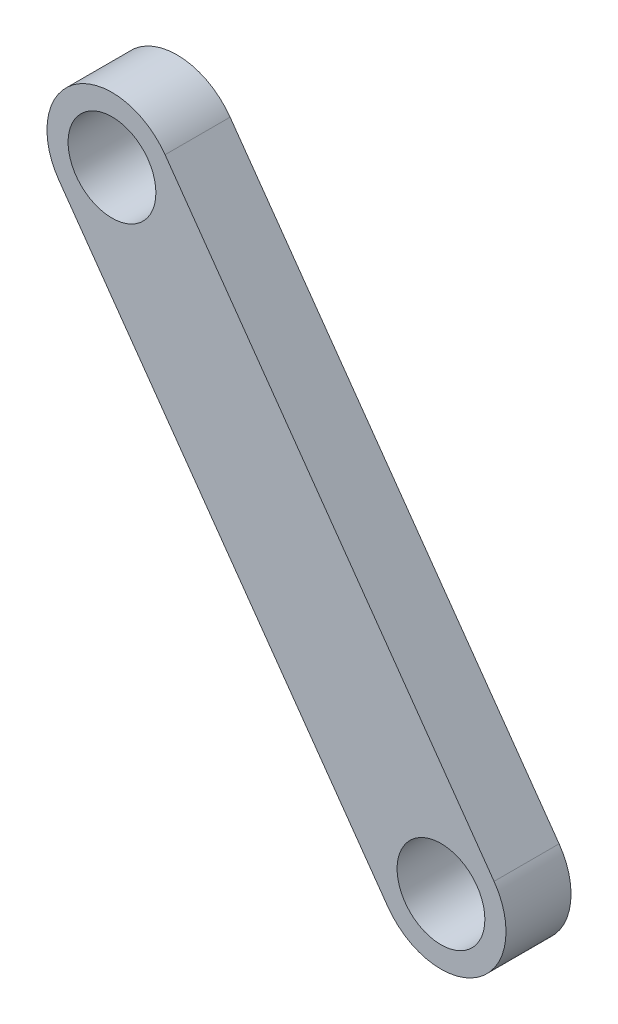
ISO-10303-21;
HEADER;
FILE_DESCRIPTION(('STEP AP214'),'2;1');
FILE_NAME('part.step','',(''),(''),'','','');
FILE_SCHEMA(('AUTOMOTIVE_DESIGN { 1 0 10303 214 1 1 1 1 }'));
ENDSEC;
DATA;
#1=APPLICATION_CONTEXT('core data for automotive mechanical design processes');
#2=APPLICATION_PROTOCOL_DEFINITION('international standard','automotive_design',2000,#1);
#3=PRODUCT_CONTEXT('',#1,'mechanical');
#4=PRODUCT('Part','Part','',(#3));
#5=PRODUCT_RELATED_PRODUCT_CATEGORY('part','',(#4));
#6=PRODUCT_DEFINITION_FORMATION('','',#4);
#7=PRODUCT_DEFINITION_CONTEXT('part definition',#1,'design');
#8=PRODUCT_DEFINITION('design','',#6,#7);
#9=PRODUCT_DEFINITION_SHAPE('','',#8);
#10=(LENGTH_UNIT() NAMED_UNIT(*) SI_UNIT(.MILLI.,.METRE.));
#11=(NAMED_UNIT(*) PLANE_ANGLE_UNIT() SI_UNIT($,.RADIAN.));
#12=(NAMED_UNIT(*) SI_UNIT($,.STERADIAN.) SOLID_ANGLE_UNIT());
#13=UNCERTAINTY_MEASURE_WITH_UNIT(LENGTH_MEASURE(1.E-05),#10,'distance_accuracy_value','');
#14=(GEOMETRIC_REPRESENTATION_CONTEXT(3) GLOBAL_UNCERTAINTY_ASSIGNED_CONTEXT((#13)) GLOBAL_UNIT_ASSIGNED_CONTEXT((#10,
#11,#12)) REPRESENTATION_CONTEXT('',''));
#15=CARTESIAN_POINT('',(0.,0.,0.));
#16=DIRECTION('',(0.,0.,1.));
#17=DIRECTION('',(1.,0.,0.));
#18=AXIS2_PLACEMENT_3D('',#15,#16,#17);
#19=CARTESIAN_POINT('',(-20.2376439033438,28.5915681073832,4.));
#20=DIRECTION('',(0.,0.,1.));
#21=DIRECTION('',(1.,0.,0.));
#22=AXIS2_PLACEMENT_3D('',#19,#20,#21);
#23=PLANE('',#22);
#24=CARTESIAN_POINT('',(0.,0.,4.));
#25=DIRECTION('',(0.,0.,1.));
#26=DIRECTION('',(1.,0.,0.));
#27=AXIS2_PLACEMENT_3D('',#24,#25,#26);
#28=CIRCLE('',#27,2.7);
#29=CARTESIAN_POINT('',(2.7,0.,4.));
#30=VERTEX_POINT('',#29);
#31=EDGE_CURVE('E112',#30,#30,#28,.T.);
#32=ORIENTED_EDGE('',*,*,#31,.F.);
#33=EDGE_LOOP('',(#32));
#34=FACE_BOUND('',#33,.T.);
#35=CARTESIAN_POINT('',(-20.2376439033438,28.5915681073832,4.));
#36=DIRECTION('',(0.,0.,1.));
#37=DIRECTION('',(1.,0.,0.));
#38=AXIS2_PLACEMENT_3D('',#35,#36,#37);
#39=CIRCLE('',#38,4.);
#40=CARTESIAN_POINT('',(-16.9727535065767,30.9025182793033,4.));
#41=VERTEX_POINT('',#40);
#42=CARTESIAN_POINT('',(-23.502534300111,26.2806179354631,4.));
#43=VERTEX_POINT('',#42);
#44=EDGE_CURVE('E92',#41,#43,#39,.T.);
#45=ORIENTED_EDGE('',*,*,#44,.T.);
#46=DIRECTION('',(0.577737542980016,-0.816222599191798,0.));
#47=VECTOR('',#46,1.);
#48=CARTESIAN_POINT('',(-3.26489039676719,-2.31095017192006,4.));
#49=LINE('',#48,#47);
#50=CARTESIAN_POINT('',(-3.26489039676719,-2.31095017192006,4.));
#51=VERTEX_POINT('',#50);
#52=EDGE_CURVE('E87',#43,#51,#49,.T.);
#53=ORIENTED_EDGE('',*,*,#52,.T.);
#54=CARTESIAN_POINT('',(0.,0.,4.));
#55=DIRECTION('',(0.,0.,1.));
#56=DIRECTION('',(1.,0.,0.));
#57=AXIS2_PLACEMENT_3D('',#54,#55,#56);
#58=CIRCLE('',#57,4.);
#59=CARTESIAN_POINT('',(3.26489039676719,2.31095017192006,4.));
#60=VERTEX_POINT('',#59);
#61=EDGE_CURVE('E90',#51,#60,#58,.T.);
#62=ORIENTED_EDGE('',*,*,#61,.T.);
#63=DIRECTION('',(-0.577737542980016,0.816222599191798,0.));
#64=VECTOR('',#63,1.);
#65=CARTESIAN_POINT('',(-16.9727535065767,30.9025182793033,4.));
#66=LINE('',#65,#64);
#67=EDGE_CURVE('E57',#60,#41,#66,.T.);
#68=ORIENTED_EDGE('',*,*,#67,.T.);
#69=EDGE_LOOP('',(#45,#53,#62,#68));
#70=FACE_BOUND('',#69,.T.);
#71=CARTESIAN_POINT('',(-20.2376439033438,28.5915681073832,4.));
#72=DIRECTION('',(0.,0.,1.));
#73=DIRECTION('',(1.,0.,0.));
#74=AXIS2_PLACEMENT_3D('',#71,#72,#73);
#75=CIRCLE('',#74,2.7);
#76=CARTESIAN_POINT('',(-17.5376439033438,28.5915681073832,4.));
#77=VERTEX_POINT('',#76);
#78=EDGE_CURVE('E134',#77,#77,#75,.T.);
#79=ORIENTED_EDGE('',*,*,#78,.F.);
#80=EDGE_LOOP('',(#79));
#81=FACE_BOUND('',#80,.T.);
#82=ADVANCED_FACE('F39',(#34,#70,#81),#23,.T.);
#83=CARTESIAN_POINT('',(-20.2376439033438,28.5915681073832,0.));
#84=DIRECTION('',(0.,0.,1.));
#85=DIRECTION('',(1.,0.,0.));
#86=AXIS2_PLACEMENT_3D('',#83,#84,#85);
#87=PLANE('',#86);
#88=CARTESIAN_POINT('',(-20.2376439033438,28.5915681073832,0.));
#89=DIRECTION('',(0.,0.,1.));
#90=DIRECTION('',(1.,0.,0.));
#91=AXIS2_PLACEMENT_3D('',#88,#89,#90);
#92=CIRCLE('',#91,4.);
#93=CARTESIAN_POINT('',(-16.9727535065767,30.9025182793033,0.));
#94=VERTEX_POINT('',#93);
#95=CARTESIAN_POINT('',(-23.502534300111,26.2806179354631,0.));
#96=VERTEX_POINT('',#95);
#97=EDGE_CURVE('E108',#94,#96,#92,.T.);
#98=ORIENTED_EDGE('',*,*,#97,.F.);
#99=DIRECTION('',(-0.577737542980016,0.816222599191798,0.));
#100=VECTOR('',#99,1.);
#101=CARTESIAN_POINT('',(-16.9727535065767,30.9025182793033,0.));
#102=LINE('',#101,#100);
#103=CARTESIAN_POINT('',(3.26489039676719,2.31095017192006,0.));
#104=VERTEX_POINT('',#103);
#105=EDGE_CURVE('E80',#104,#94,#102,.T.);
#106=ORIENTED_EDGE('',*,*,#105,.F.);
#107=CARTESIAN_POINT('',(0.,0.,0.));
#108=DIRECTION('',(0.,0.,1.));
#109=DIRECTION('',(1.,0.,0.));
#110=AXIS2_PLACEMENT_3D('',#107,#108,#109);
#111=CIRCLE('',#110,4.);
#112=CARTESIAN_POINT('',(-3.26489039676719,-2.31095017192006,0.));
#113=VERTEX_POINT('',#112);
#114=EDGE_CURVE('E74',#113,#104,#111,.T.);
#115=ORIENTED_EDGE('',*,*,#114,.F.);
#116=DIRECTION('',(0.577737542980016,-0.816222599191798,0.));
#117=VECTOR('',#116,1.);
#118=CARTESIAN_POINT('',(-3.26489039676719,-2.31095017192006,0.));
#119=LINE('',#118,#117);
#120=EDGE_CURVE('E97',#96,#113,#119,.T.);
#121=ORIENTED_EDGE('',*,*,#120,.F.);
#122=EDGE_LOOP('',(#98,#106,#115,#121));
#123=FACE_BOUND('',#122,.T.);
#124=CARTESIAN_POINT('',(0.,0.,0.));
#125=DIRECTION('',(0.,0.,1.));
#126=DIRECTION('',(1.,0.,0.));
#127=AXIS2_PLACEMENT_3D('',#124,#125,#126);
#128=CIRCLE('',#127,2.7);
#129=CARTESIAN_POINT('',(2.7,0.,0.));
#130=VERTEX_POINT('',#129);
#131=EDGE_CURVE('E130',#130,#130,#128,.T.);
#132=ORIENTED_EDGE('',*,*,#131,.T.);
#133=EDGE_LOOP('',(#132));
#134=FACE_BOUND('',#133,.T.);
#135=CARTESIAN_POINT('',(-20.2376439033438,28.5915681073832,0.));
#136=DIRECTION('',(0.,0.,1.));
#137=DIRECTION('',(1.,0.,0.));
#138=AXIS2_PLACEMENT_3D('',#135,#136,#137);
#139=CIRCLE('',#138,2.7);
#140=CARTESIAN_POINT('',(-17.5376439033438,28.5915681073832,0.));
#141=VERTEX_POINT('',#140);
#142=EDGE_CURVE('E138',#141,#141,#139,.T.);
#143=ORIENTED_EDGE('',*,*,#142,.T.);
#144=EDGE_LOOP('',(#143));
#145=FACE_BOUND('',#144,.T.);
#146=ADVANCED_FACE('F125',(#123,#134,#145),#87,.F.);
#147=CARTESIAN_POINT('',(-20.2376439033438,28.5915681073832,4.));
#148=DIRECTION('',(0.,0.,-1.));
#149=DIRECTION('',(-1.,0.,0.));
#150=AXIS2_PLACEMENT_3D('',#147,#148,#149);
#151=CYLINDRICAL_SURFACE('',#150,4.);
#152=ORIENTED_EDGE('',*,*,#97,.T.);
#153=DIRECTION('',(0.,0.,-1.));
#154=VECTOR('',#153,1.);
#155=CARTESIAN_POINT('',(-23.502534300111,26.2806179354631,4.));
#156=LINE('',#155,#154);
#157=EDGE_CURVE('E11',#43,#96,#156,.T.);
#158=ORIENTED_EDGE('',*,*,#157,.F.);
#159=ORIENTED_EDGE('',*,*,#44,.F.);
#160=DIRECTION('',(0.,0.,-1.));
#161=VECTOR('',#160,1.);
#162=CARTESIAN_POINT('',(-16.9727535065767,30.9025182793033,4.));
#163=LINE('',#162,#161);
#164=EDGE_CURVE('E104',#41,#94,#163,.T.);
#165=ORIENTED_EDGE('',*,*,#164,.T.);
#166=EDGE_LOOP('',(#152,#158,#159,#165));
#167=FACE_BOUND('',#166,.T.);
#168=ADVANCED_FACE('F41',(#167),#151,.T.);
#169=CARTESIAN_POINT('',(-3.26489039676719,-2.31095017192006,4.));
#170=DIRECTION('',(0.816222599191798,0.577737542980016,0.));
#171=DIRECTION('',(-0.577737542980016,0.816222599191798,0.));
#172=AXIS2_PLACEMENT_3D('',#169,#170,#171);
#173=PLANE('',#172);
#174=ORIENTED_EDGE('',*,*,#120,.T.);
#175=DIRECTION('',(0.,0.,-1.));
#176=VECTOR('',#175,1.);
#177=CARTESIAN_POINT('',(-3.26489039676719,-2.31095017192006,4.));
#178=LINE('',#177,#176);
#179=EDGE_CURVE('E49',#51,#113,#178,.T.);
#180=ORIENTED_EDGE('',*,*,#179,.F.);
#181=ORIENTED_EDGE('',*,*,#52,.F.);
#182=ORIENTED_EDGE('',*,*,#157,.T.);
#183=EDGE_LOOP('',(#174,#180,#181,#182));
#184=FACE_BOUND('',#183,.T.);
#185=ADVANCED_FACE('F96',(#184),#173,.F.);
#186=CARTESIAN_POINT('',(0.,0.,4.));
#187=DIRECTION('',(0.,0.,-1.));
#188=DIRECTION('',(-1.,0.,0.));
#189=AXIS2_PLACEMENT_3D('',#186,#187,#188);
#190=CYLINDRICAL_SURFACE('',#189,4.);
#191=ORIENTED_EDGE('',*,*,#114,.T.);
#192=DIRECTION('',(0.,0.,-1.));
#193=VECTOR('',#192,1.);
#194=CARTESIAN_POINT('',(3.26489039676719,2.31095017192006,4.));
#195=LINE('',#194,#193);
#196=EDGE_CURVE('E99',#60,#104,#195,.T.);
#197=ORIENTED_EDGE('',*,*,#196,.F.);
#198=ORIENTED_EDGE('',*,*,#61,.F.);
#199=ORIENTED_EDGE('',*,*,#179,.T.);
#200=EDGE_LOOP('',(#191,#197,#198,#199));
#201=FACE_BOUND('',#200,.T.);
#202=ADVANCED_FACE('F100',(#201),#190,.T.);
#203=CARTESIAN_POINT('',(-16.9727535065767,30.9025182793033,4.));
#204=DIRECTION('',(-0.816222599191798,-0.577737542980016,0.));
#205=DIRECTION('',(0.577737542980016,-0.816222599191798,0.));
#206=AXIS2_PLACEMENT_3D('',#203,#204,#205);
#207=PLANE('',#206);
#208=ORIENTED_EDGE('',*,*,#105,.T.);
#209=ORIENTED_EDGE('',*,*,#164,.F.);
#210=ORIENTED_EDGE('',*,*,#67,.F.);
#211=ORIENTED_EDGE('',*,*,#196,.T.);
#212=EDGE_LOOP('',(#208,#209,#210,#211));
#213=FACE_BOUND('',#212,.T.);
#214=ADVANCED_FACE('F122',(#213),#207,.F.);
#215=CARTESIAN_POINT('',(0.,0.,4.));
#216=DIRECTION('',(0.,0.,-1.));
#217=DIRECTION('',(-1.,0.,0.));
#218=AXIS2_PLACEMENT_3D('',#215,#216,#217);
#219=CYLINDRICAL_SURFACE('',#218,2.7);
#220=ORIENTED_EDGE('',*,*,#31,.T.);
#221=EDGE_LOOP('',(#220));
#222=FACE_BOUND('',#221,.T.);
#223=ORIENTED_EDGE('',*,*,#131,.F.);
#224=EDGE_LOOP('',(#223));
#225=FACE_BOUND('',#224,.T.);
#226=ADVANCED_FACE('F157',(#222,#225),#219,.F.);
#227=CARTESIAN_POINT('',(-20.2376439033438,28.5915681073832,4.));
#228=DIRECTION('',(0.,0.,-1.));
#229=DIRECTION('',(-1.,0.,0.));
#230=AXIS2_PLACEMENT_3D('',#227,#228,#229);
#231=CYLINDRICAL_SURFACE('',#230,2.7);
#232=ORIENTED_EDGE('',*,*,#78,.T.);
#233=EDGE_LOOP('',(#232));
#234=FACE_BOUND('',#233,.T.);
#235=ORIENTED_EDGE('',*,*,#142,.F.);
#236=EDGE_LOOP('',(#235));
#237=FACE_BOUND('',#236,.T.);
#238=ADVANCED_FACE('F146',(#234,#237),#231,.F.);
#239=CLOSED_SHELL('',(#82,#146,#168,#185,#202,#214,#226,#238));
#240=MANIFOLD_SOLID_BREP('B2',#239);
#241=ADVANCED_BREP_SHAPE_REPRESENTATION('',(#18,#240),#14);
#242=SHAPE_DEFINITION_REPRESENTATION(#9,#241);
ENDSEC;
END-ISO-10303-21;
